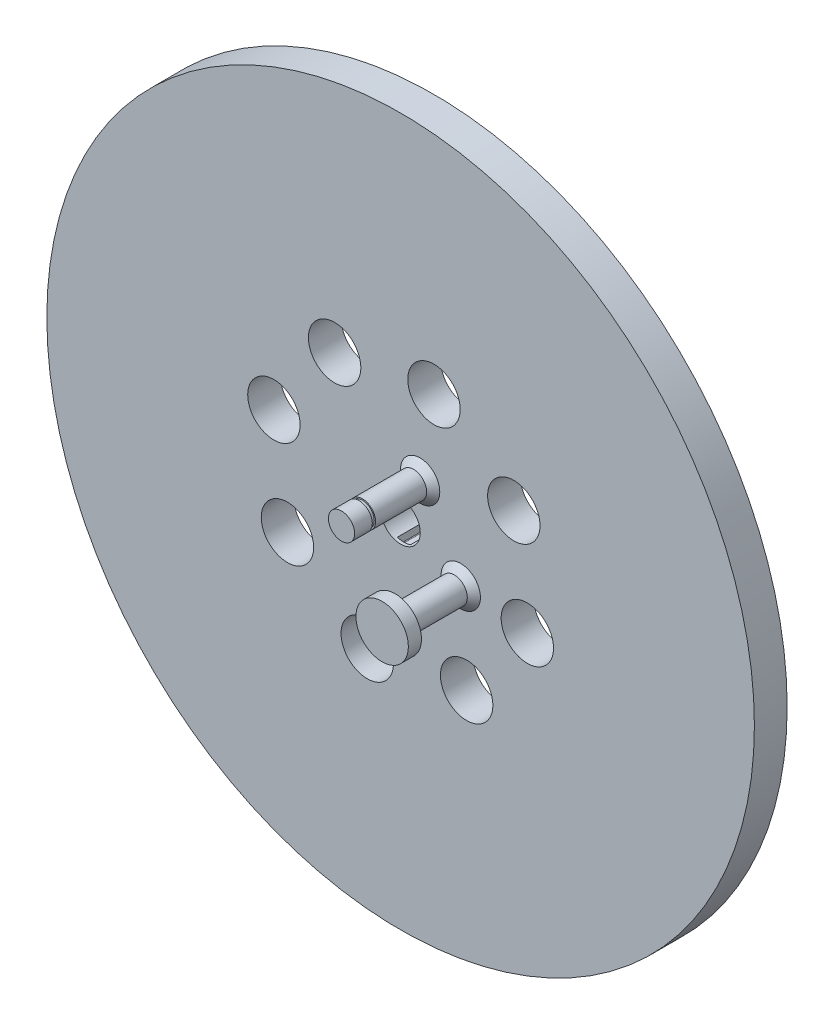
ISO-10303-21;
HEADER;
FILE_DESCRIPTION(('STEP AP214'),'2;1');
FILE_NAME('part.step','',(''),(''),'','','');
FILE_SCHEMA(('AUTOMOTIVE_DESIGN { 1 0 10303 214 1 1 1 1 }'));
ENDSEC;
DATA;
#1=APPLICATION_CONTEXT('core data for automotive mechanical design processes');
#2=APPLICATION_PROTOCOL_DEFINITION('international standard','automotive_design',2000,#1);
#3=PRODUCT_CONTEXT('',#1,'mechanical');
#4=PRODUCT('Part','Part','',(#3));
#5=PRODUCT_RELATED_PRODUCT_CATEGORY('part','',(#4));
#6=PRODUCT_DEFINITION_FORMATION('','',#4);
#7=PRODUCT_DEFINITION_CONTEXT('part definition',#1,'design');
#8=PRODUCT_DEFINITION('design','',#6,#7);
#9=PRODUCT_DEFINITION_SHAPE('','',#8);
#10=(LENGTH_UNIT() NAMED_UNIT(*) SI_UNIT(.MILLI.,.METRE.));
#11=(NAMED_UNIT(*) PLANE_ANGLE_UNIT() SI_UNIT($,.RADIAN.));
#12=(NAMED_UNIT(*) SI_UNIT($,.STERADIAN.) SOLID_ANGLE_UNIT());
#13=UNCERTAINTY_MEASURE_WITH_UNIT(LENGTH_MEASURE(1.E-05),#10,'distance_accuracy_value','');
#14=(GEOMETRIC_REPRESENTATION_CONTEXT(3) GLOBAL_UNCERTAINTY_ASSIGNED_CONTEXT((#13)) GLOBAL_UNIT_ASSIGNED_CONTEXT((#10,
#11,#12)) REPRESENTATION_CONTEXT('',''));
#15=CARTESIAN_POINT('',(0.,0.,0.));
#16=DIRECTION('',(0.,0.,1.));
#17=DIRECTION('',(1.,0.,0.));
#18=AXIS2_PLACEMENT_3D('',#15,#16,#17);
#19=CARTESIAN_POINT('',(0.,0.,5.));
#20=DIRECTION('',(0.,0.,-1.));
#21=DIRECTION('',(-1.,0.,0.));
#22=AXIS2_PLACEMENT_3D('',#19,#20,#21);
#23=CYLINDRICAL_SURFACE('',#22,3.);
#24=CARTESIAN_POINT('',(0.,0.,5.));
#25=DIRECTION('',(0.,0.,1.));
#26=DIRECTION('',(1.,0.,0.));
#27=AXIS2_PLACEMENT_3D('',#24,#25,#26);
#28=CIRCLE('',#27,3.);
#29=CARTESIAN_POINT('',(3.,0.,5.));
#30=VERTEX_POINT('',#29);
#31=EDGE_CURVE('E272',#30,#30,#28,.T.);
#32=ORIENTED_EDGE('',*,*,#31,.T.);
#33=EDGE_LOOP('',(#32));
#34=FACE_BOUND('',#33,.T.);
#35=CARTESIAN_POINT('',(0.,0.,0.));
#36=DIRECTION('',(0.,0.,1.));
#37=DIRECTION('',(1.,0.,0.));
#38=AXIS2_PLACEMENT_3D('',#35,#36,#37);
#39=CIRCLE('',#38,3.);
#40=CARTESIAN_POINT('',(3.,0.,0.));
#41=VERTEX_POINT('',#40);
#42=EDGE_CURVE('E268',#41,#41,#39,.T.);
#43=ORIENTED_EDGE('',*,*,#42,.F.);
#44=EDGE_LOOP('',(#43));
#45=FACE_BOUND('',#44,.T.);
#46=DIRECTION('',(0.,0.,-1.));
#47=VECTOR('',#46,1.);
#48=CARTESIAN_POINT('',(-0.999999999999999,-2.82842712474619,5.));
#49=LINE('',#48,#47);
#50=CARTESIAN_POINT('',(-0.999999999999999,-2.82842712474619,0.5));
#51=VERTEX_POINT('',#50);
#52=CARTESIAN_POINT('',(-0.999999999999999,-2.82842712474619,4.5));
#53=VERTEX_POINT('',#52);
#54=EDGE_CURVE('E129',#51,#53,#49,.F.);
#55=ORIENTED_EDGE('',*,*,#54,.F.);
#56=CARTESIAN_POINT('',(0.,0.,0.5));
#57=DIRECTION('',(0.,0.,1.));
#58=DIRECTION('',(1.,0.,0.));
#59=AXIS2_PLACEMENT_3D('',#56,#57,#58);
#60=CIRCLE('',#59,3.);
#61=CARTESIAN_POINT('',(1.,-2.82842712474619,0.5));
#62=VERTEX_POINT('',#61);
#63=EDGE_CURVE('E132',#51,#62,#60,.T.);
#64=ORIENTED_EDGE('',*,*,#63,.T.);
#65=DIRECTION('',(0.,0.,-1.));
#66=VECTOR('',#65,1.);
#67=CARTESIAN_POINT('',(1.,-2.82842712474619,5.));
#68=LINE('',#67,#66);
#69=CARTESIAN_POINT('',(1.,-2.82842712474619,4.5));
#70=VERTEX_POINT('',#69);
#71=EDGE_CURVE('E114',#70,#62,#68,.T.);
#72=ORIENTED_EDGE('',*,*,#71,.F.);
#73=CARTESIAN_POINT('',(0.,0.,4.5));
#74=DIRECTION('',(0.,0.,1.));
#75=DIRECTION('',(1.,0.,0.));
#76=AXIS2_PLACEMENT_3D('',#73,#74,#75);
#77=CIRCLE('',#76,3.);
#78=EDGE_CURVE('E122',#53,#70,#77,.T.);
#79=ORIENTED_EDGE('',*,*,#78,.F.);
#80=EDGE_LOOP('',(#55,#64,#72,#79));
#81=FACE_BOUND('',#80,.T.);
#82=ADVANCED_FACE('F53',(#34,#45,#81),#23,.F.);
#83=CARTESIAN_POINT('',(9.17867077053944,-3.96887929849786,17.));
#84=DIRECTION('',(0.,0.,-1.));
#85=DIRECTION('',(-1.,0.,0.));
#86=AXIS2_PLACEMENT_3D('',#83,#84,#85);
#87=CYLINDRICAL_SURFACE('',#86,2.);
#88=CARTESIAN_POINT('',(9.17867077053944,-3.96887929849786,6.00000000000001));
#89=DIRECTION('',(0.,0.,1.));
#90=DIRECTION('',(1.,0.,0.));
#91=AXIS2_PLACEMENT_3D('',#88,#89,#90);
#92=CIRCLE('',#91,2.);
#93=CARTESIAN_POINT('',(11.1786707705394,-3.96887929849786,6.00000000000001));
#94=VERTEX_POINT('',#93);
#95=EDGE_CURVE('E291',#94,#94,#92,.T.);
#96=ORIENTED_EDGE('',*,*,#95,.T.);
#97=EDGE_LOOP('',(#96));
#98=FACE_BOUND('',#97,.T.);
#99=CARTESIAN_POINT('',(9.17867077053944,-3.96887929849786,15.));
#100=DIRECTION('',(0.,0.,1.));
#101=DIRECTION('',(1.,0.,0.));
#102=AXIS2_PLACEMENT_3D('',#99,#100,#101);
#103=CIRCLE('',#102,2.);
#104=CARTESIAN_POINT('',(11.1786707705394,-3.96887929849786,15.));
#105=VERTEX_POINT('',#104);
#106=EDGE_CURVE('E284',#105,#105,#103,.T.);
#107=ORIENTED_EDGE('',*,*,#106,.F.);
#108=EDGE_LOOP('',(#107));
#109=FACE_BOUND('',#108,.T.);
#110=ADVANCED_FACE('F327',(#98,#109),#87,.T.);
#111=CARTESIAN_POINT('',(2.97665947387337,6.88400307790459,17.));
#112=DIRECTION('',(0.,0.,-1.));
#113=DIRECTION('',(-1.,0.,0.));
#114=AXIS2_PLACEMENT_3D('',#111,#112,#113);
#115=CYLINDRICAL_SURFACE('',#114,2.);
#116=CARTESIAN_POINT('',(2.97665947387337,6.88400307790459,6.00000000000001));
#117=DIRECTION('',(0.,0.,1.));
#118=DIRECTION('',(1.,0.,0.));
#119=AXIS2_PLACEMENT_3D('',#116,#117,#118);
#120=CIRCLE('',#119,2.);
#121=CARTESIAN_POINT('',(4.97665947387337,6.88400307790459,6.00000000000001));
#122=VERTEX_POINT('',#121);
#123=EDGE_CURVE('E130',#122,#122,#120,.T.);
#124=ORIENTED_EDGE('',*,*,#123,.T.);
#125=EDGE_LOOP('',(#124));
#126=FACE_BOUND('',#125,.T.);
#127=CARTESIAN_POINT('',(2.97665947387337,6.88400307790459,13.8));
#128=DIRECTION('',(0.,0.,1.));
#129=DIRECTION('',(1.,0.,0.));
#130=AXIS2_PLACEMENT_3D('',#127,#128,#129);
#131=CIRCLE('',#130,2.);
#132=CARTESIAN_POINT('',(4.97665947387337,6.88400307790459,13.8));
#133=VERTEX_POINT('',#132);
#134=EDGE_CURVE('E192',#133,#133,#131,.T.);
#135=ORIENTED_EDGE('',*,*,#134,.F.);
#136=EDGE_LOOP('',(#135));
#137=FACE_BOUND('',#136,.T.);
#138=ADVANCED_FACE('F307',(#126,#137),#115,.T.);
#139=CARTESIAN_POINT('',(0.,0.,5.));
#140=DIRECTION('',(0.,0.,1.));
#141=DIRECTION('',(1.,0.,0.));
#142=AXIS2_PLACEMENT_3D('',#139,#140,#141);
#143=PLANE('',#142);
#144=CARTESIAN_POINT('',(9.17867077053944,-3.96887929849786,5.));
#145=DIRECTION('',(0.,0.,1.));
#146=DIRECTION('',(1.,0.,0.));
#147=AXIS2_PLACEMENT_3D('',#144,#145,#146);
#148=CIRCLE('',#147,3.);
#149=CARTESIAN_POINT('',(12.1786707705394,-3.96887929849786,5.));
#150=VERTEX_POINT('',#149);
#151=EDGE_CURVE('E299',#150,#150,#148,.F.);
#152=ORIENTED_EDGE('',*,*,#151,.T.);
#153=EDGE_LOOP('',(#152));
#154=FACE_BOUND('',#153,.T.);
#155=CARTESIAN_POINT('',(2.97665947387337,6.88400307790459,5.));
#156=DIRECTION('',(0.,0.,1.));
#157=DIRECTION('',(1.,0.,0.));
#158=AXIS2_PLACEMENT_3D('',#155,#156,#157);
#159=CIRCLE('',#158,3.);
#160=CARTESIAN_POINT('',(5.97665947387337,6.88400307790459,5.));
#161=VERTEX_POINT('',#160);
#162=EDGE_CURVE('E295',#161,#161,#159,.F.);
#163=ORIENTED_EDGE('',*,*,#162,.T.);
#164=EDGE_LOOP('',(#163));
#165=FACE_BOUND('',#164,.T.);
#166=CARTESIAN_POINT('',(17.2762876026621,10.0762039811679,5.));
#167=DIRECTION('',(0.,0.,-1.));
#168=DIRECTION('',(-1.,0.,0.));
#169=AXIS2_PLACEMENT_3D('',#166,#167,#168);
#170=CIRCLE('',#169,4.);
#171=CARTESIAN_POINT('',(13.2762876026621,10.0762039811679,5.));
#172=VERTEX_POINT('',#171);
#173=EDGE_CURVE('E207',#172,#172,#170,.T.);
#174=ORIENTED_EDGE('',*,*,#173,.T.);
#175=EDGE_LOOP('',(#174));
#176=FACE_BOUND('',#175,.T.);
#177=CARTESIAN_POINT('',(19.3411322812741,-5.0912279538688,5.));
#178=DIRECTION('',(0.,0.,-1.));
#179=DIRECTION('',(-1.,0.,0.));
#180=AXIS2_PLACEMENT_3D('',#177,#178,#179);
#181=CIRCLE('',#180,4.);
#182=CARTESIAN_POINT('',(15.3411322812741,-5.0912279538688,5.));
#183=VERTEX_POINT('',#182);
#184=EDGE_CURVE('E253',#183,#183,#181,.T.);
#185=ORIENTED_EDGE('',*,*,#184,.T.);
#186=EDGE_LOOP('',(#185));
#187=FACE_BOUND('',#186,.T.);
#188=CARTESIAN_POINT('',(10.0762039811678,-17.2762876026621,5.));
#189=DIRECTION('',(0.,0.,-1.));
#190=DIRECTION('',(-1.,0.,0.));
#191=AXIS2_PLACEMENT_3D('',#188,#189,#190);
#192=CIRCLE('',#191,4.);
#193=CARTESIAN_POINT('',(6.07620398116782,-17.2762876026621,5.));
#194=VERTEX_POINT('',#193);
#195=EDGE_CURVE('E245',#194,#194,#192,.T.);
#196=ORIENTED_EDGE('',*,*,#195,.T.);
#197=EDGE_LOOP('',(#196));
#198=FACE_BOUND('',#197,.T.);
#199=CARTESIAN_POINT('',(-5.09122795386886,-19.3411322812741,5.));
#200=DIRECTION('',(0.,0.,-1.));
#201=DIRECTION('',(-1.,0.,0.));
#202=AXIS2_PLACEMENT_3D('',#199,#200,#201);
#203=CIRCLE('',#202,4.);
#204=CARTESIAN_POINT('',(-9.09122795386886,-19.3411322812741,5.));
#205=VERTEX_POINT('',#204);
#206=EDGE_CURVE('E237',#205,#205,#203,.T.);
#207=ORIENTED_EDGE('',*,*,#206,.T.);
#208=EDGE_LOOP('',(#207));
#209=FACE_BOUND('',#208,.T.);
#210=CARTESIAN_POINT('',(-17.2762876026622,-10.0762039811678,5.));
#211=DIRECTION('',(0.,0.,-1.));
#212=DIRECTION('',(-1.,0.,0.));
#213=AXIS2_PLACEMENT_3D('',#210,#211,#212);
#214=CIRCLE('',#213,4.);
#215=CARTESIAN_POINT('',(-21.2762876026622,-10.0762039811678,5.));
#216=VERTEX_POINT('',#215);
#217=EDGE_CURVE('E229',#216,#216,#214,.T.);
#218=ORIENTED_EDGE('',*,*,#217,.T.);
#219=EDGE_LOOP('',(#218));
#220=FACE_BOUND('',#219,.T.);
#221=CARTESIAN_POINT('',(-19.3411322812741,5.09122795386893,5.));
#222=DIRECTION('',(0.,0.,-1.));
#223=DIRECTION('',(-1.,0.,0.));
#224=AXIS2_PLACEMENT_3D('',#221,#222,#223);
#225=CIRCLE('',#224,4.);
#226=CARTESIAN_POINT('',(-23.3411322812741,5.09122795386893,5.));
#227=VERTEX_POINT('',#226);
#228=EDGE_CURVE('E221',#227,#227,#225,.T.);
#229=ORIENTED_EDGE('',*,*,#228,.T.);
#230=EDGE_LOOP('',(#229));
#231=FACE_BOUND('',#230,.T.);
#232=CARTESIAN_POINT('',(-10.0762039811677,17.2762876026622,5.));
#233=DIRECTION('',(0.,0.,-1.));
#234=DIRECTION('',(-1.,0.,0.));
#235=AXIS2_PLACEMENT_3D('',#232,#233,#234);
#236=CIRCLE('',#235,4.);
#237=CARTESIAN_POINT('',(-14.0762039811677,17.2762876026622,5.));
#238=VERTEX_POINT('',#237);
#239=EDGE_CURVE('E213',#238,#238,#236,.T.);
#240=ORIENTED_EDGE('',*,*,#239,.T.);
#241=EDGE_LOOP('',(#240));
#242=FACE_BOUND('',#241,.T.);
#243=CARTESIAN_POINT('',(5.091227953869,19.3411322812741,5.));
#244=DIRECTION('',(0.,0.,-1.));
#245=DIRECTION('',(-1.,0.,0.));
#246=AXIS2_PLACEMENT_3D('',#243,#244,#245);
#247=CIRCLE('',#246,4.);
#248=CARTESIAN_POINT('',(1.091227953869,19.3411322812741,5.));
#249=VERTEX_POINT('',#248);
#250=EDGE_CURVE('E264',#249,#249,#247,.T.);
#251=ORIENTED_EDGE('',*,*,#250,.T.);
#252=EDGE_LOOP('',(#251));
#253=FACE_BOUND('',#252,.T.);
#254=CARTESIAN_POINT('',(0.,0.,5.));
#255=DIRECTION('',(0.,0.,1.));
#256=DIRECTION('',(1.,0.,0.));
#257=AXIS2_PLACEMENT_3D('',#254,#255,#256);
#258=CIRCLE('',#257,54.);
#259=CARTESIAN_POINT('',(54.,0.,5.));
#260=VERTEX_POINT('',#259);
#261=EDGE_CURVE('E280',#260,#260,#258,.T.);
#262=ORIENTED_EDGE('',*,*,#261,.T.);
#263=EDGE_LOOP('',(#262));
#264=FACE_BOUND('',#263,.T.);
#265=ORIENTED_EDGE('',*,*,#31,.F.);
#266=EDGE_LOOP('',(#265));
#267=FACE_BOUND('',#266,.T.);
#268=ADVANCED_FACE('F341',(#154,#165,#176,#187,#198,#209,#220,#231,#242,#253,#264,#267),#143,.T.);
#269=CARTESIAN_POINT('',(0.,0.,0.));
#270=DIRECTION('',(0.,0.,1.));
#271=DIRECTION('',(1.,0.,0.));
#272=AXIS2_PLACEMENT_3D('',#269,#270,#271);
#273=PLANE('',#272);
#274=CARTESIAN_POINT('',(17.2762876026621,10.0762039811679,0.));
#275=DIRECTION('',(0.,0.,-1.));
#276=DIRECTION('',(-1.,0.,0.));
#277=AXIS2_PLACEMENT_3D('',#274,#275,#276);
#278=CIRCLE('',#277,4.);
#279=CARTESIAN_POINT('',(13.2762876026621,10.0762039811679,0.));
#280=VERTEX_POINT('',#279);
#281=EDGE_CURVE('E257',#280,#280,#278,.T.);
#282=ORIENTED_EDGE('',*,*,#281,.F.);
#283=EDGE_LOOP('',(#282));
#284=FACE_BOUND('',#283,.T.);
#285=CARTESIAN_POINT('',(19.3411322812741,-5.0912279538688,0.));
#286=DIRECTION('',(0.,0.,-1.));
#287=DIRECTION('',(-1.,0.,0.));
#288=AXIS2_PLACEMENT_3D('',#285,#286,#287);
#289=CIRCLE('',#288,4.);
#290=CARTESIAN_POINT('',(15.3411322812741,-5.0912279538688,0.));
#291=VERTEX_POINT('',#290);
#292=EDGE_CURVE('E249',#291,#291,#289,.T.);
#293=ORIENTED_EDGE('',*,*,#292,.F.);
#294=EDGE_LOOP('',(#293));
#295=FACE_BOUND('',#294,.T.);
#296=CARTESIAN_POINT('',(10.0762039811678,-17.2762876026621,0.));
#297=DIRECTION('',(0.,0.,-1.));
#298=DIRECTION('',(-1.,0.,0.));
#299=AXIS2_PLACEMENT_3D('',#296,#297,#298);
#300=CIRCLE('',#299,4.);
#301=CARTESIAN_POINT('',(6.07620398116782,-17.2762876026621,0.));
#302=VERTEX_POINT('',#301);
#303=EDGE_CURVE('E241',#302,#302,#300,.T.);
#304=ORIENTED_EDGE('',*,*,#303,.F.);
#305=EDGE_LOOP('',(#304));
#306=FACE_BOUND('',#305,.T.);
#307=CARTESIAN_POINT('',(-5.09122795386886,-19.3411322812741,0.));
#308=DIRECTION('',(0.,0.,-1.));
#309=DIRECTION('',(-1.,0.,0.));
#310=AXIS2_PLACEMENT_3D('',#307,#308,#309);
#311=CIRCLE('',#310,4.);
#312=CARTESIAN_POINT('',(-9.09122795386886,-19.3411322812741,0.));
#313=VERTEX_POINT('',#312);
#314=EDGE_CURVE('E233',#313,#313,#311,.T.);
#315=ORIENTED_EDGE('',*,*,#314,.F.);
#316=EDGE_LOOP('',(#315));
#317=FACE_BOUND('',#316,.T.);
#318=CARTESIAN_POINT('',(-17.2762876026622,-10.0762039811678,0.));
#319=DIRECTION('',(0.,0.,-1.));
#320=DIRECTION('',(-1.,0.,0.));
#321=AXIS2_PLACEMENT_3D('',#318,#319,#320);
#322=CIRCLE('',#321,4.);
#323=CARTESIAN_POINT('',(-21.2762876026622,-10.0762039811678,0.));
#324=VERTEX_POINT('',#323);
#325=EDGE_CURVE('E225',#324,#324,#322,.T.);
#326=ORIENTED_EDGE('',*,*,#325,.F.);
#327=EDGE_LOOP('',(#326));
#328=FACE_BOUND('',#327,.T.);
#329=CARTESIAN_POINT('',(-19.3411322812741,5.09122795386893,0.));
#330=DIRECTION('',(0.,0.,-1.));
#331=DIRECTION('',(-1.,0.,0.));
#332=AXIS2_PLACEMENT_3D('',#329,#330,#331);
#333=CIRCLE('',#332,4.);
#334=CARTESIAN_POINT('',(-23.3411322812741,5.09122795386893,0.));
#335=VERTEX_POINT('',#334);
#336=EDGE_CURVE('E217',#335,#335,#333,.T.);
#337=ORIENTED_EDGE('',*,*,#336,.F.);
#338=EDGE_LOOP('',(#337));
#339=FACE_BOUND('',#338,.T.);
#340=CARTESIAN_POINT('',(-10.0762039811677,17.2762876026622,0.));
#341=DIRECTION('',(0.,0.,-1.));
#342=DIRECTION('',(-1.,0.,0.));
#343=AXIS2_PLACEMENT_3D('',#340,#341,#342);
#344=CIRCLE('',#343,4.);
#345=CARTESIAN_POINT('',(-14.0762039811677,17.2762876026622,0.));
#346=VERTEX_POINT('',#345);
#347=EDGE_CURVE('E208',#346,#346,#344,.T.);
#348=ORIENTED_EDGE('',*,*,#347,.F.);
#349=EDGE_LOOP('',(#348));
#350=FACE_BOUND('',#349,.T.);
#351=CARTESIAN_POINT('',(5.091227953869,19.3411322812741,0.));
#352=DIRECTION('',(0.,0.,-1.));
#353=DIRECTION('',(-1.,0.,0.));
#354=AXIS2_PLACEMENT_3D('',#351,#352,#353);
#355=CIRCLE('',#354,4.);
#356=CARTESIAN_POINT('',(1.091227953869,19.3411322812741,0.));
#357=VERTEX_POINT('',#356);
#358=EDGE_CURVE('E212',#357,#357,#355,.T.);
#359=ORIENTED_EDGE('',*,*,#358,.F.);
#360=EDGE_LOOP('',(#359));
#361=FACE_BOUND('',#360,.T.);
#362=CARTESIAN_POINT('',(0.,0.,0.));
#363=DIRECTION('',(0.,0.,1.));
#364=DIRECTION('',(1.,0.,0.));
#365=AXIS2_PLACEMENT_3D('',#362,#363,#364);
#366=CIRCLE('',#365,54.);
#367=CARTESIAN_POINT('',(54.,0.,0.));
#368=VERTEX_POINT('',#367);
#369=EDGE_CURVE('E276',#368,#368,#366,.T.);
#370=ORIENTED_EDGE('',*,*,#369,.F.);
#371=EDGE_LOOP('',(#370));
#372=FACE_BOUND('',#371,.T.);
#373=ORIENTED_EDGE('',*,*,#42,.T.);
#374=EDGE_LOOP('',(#373));
#375=FACE_BOUND('',#374,.T.);
#376=ADVANCED_FACE('F343',(#284,#295,#306,#317,#328,#339,#350,#361,#372,#375),#273,.F.);
#377=CARTESIAN_POINT('',(0.,0.,5.));
#378=DIRECTION('',(0.,0.,-1.));
#379=DIRECTION('',(-1.,0.,0.));
#380=AXIS2_PLACEMENT_3D('',#377,#378,#379);
#381=CYLINDRICAL_SURFACE('',#380,54.);
#382=ORIENTED_EDGE('',*,*,#261,.F.);
#383=EDGE_LOOP('',(#382));
#384=FACE_BOUND('',#383,.T.);
#385=ORIENTED_EDGE('',*,*,#369,.T.);
#386=EDGE_LOOP('',(#385));
#387=FACE_BOUND('',#386,.T.);
#388=ADVANCED_FACE('F347',(#384,#387),#381,.T.);
#389=CARTESIAN_POINT('',(5.091227953869,19.3411322812741,5.));
#390=DIRECTION('',(0.,0.,-1.));
#391=DIRECTION('',(-1.,0.,0.));
#392=AXIS2_PLACEMENT_3D('',#389,#390,#391);
#393=CYLINDRICAL_SURFACE('',#392,4.);
#394=ORIENTED_EDGE('',*,*,#250,.F.);
#395=EDGE_LOOP('',(#394));
#396=FACE_BOUND('',#395,.T.);
#397=ORIENTED_EDGE('',*,*,#358,.T.);
#398=EDGE_LOOP('',(#397));
#399=FACE_BOUND('',#398,.T.);
#400=ADVANCED_FACE('F339',(#396,#399),#393,.F.);
#401=CARTESIAN_POINT('',(-10.0762039811677,17.2762876026622,5.));
#402=DIRECTION('',(0.,0.,-1.));
#403=DIRECTION('',(-1.,0.,0.));
#404=AXIS2_PLACEMENT_3D('',#401,#402,#403);
#405=CYLINDRICAL_SURFACE('',#404,4.);
#406=ORIENTED_EDGE('',*,*,#239,.F.);
#407=EDGE_LOOP('',(#406));
#408=FACE_BOUND('',#407,.T.);
#409=ORIENTED_EDGE('',*,*,#347,.T.);
#410=EDGE_LOOP('',(#409));
#411=FACE_BOUND('',#410,.T.);
#412=ADVANCED_FACE('F359',(#408,#411),#405,.F.);
#413=CARTESIAN_POINT('',(-19.3411322812741,5.09122795386893,5.));
#414=DIRECTION('',(0.,0.,-1.));
#415=DIRECTION('',(-1.,0.,0.));
#416=AXIS2_PLACEMENT_3D('',#413,#414,#415);
#417=CYLINDRICAL_SURFACE('',#416,4.);
#418=ORIENTED_EDGE('',*,*,#228,.F.);
#419=EDGE_LOOP('',(#418));
#420=FACE_BOUND('',#419,.T.);
#421=ORIENTED_EDGE('',*,*,#336,.T.);
#422=EDGE_LOOP('',(#421));
#423=FACE_BOUND('',#422,.T.);
#424=ADVANCED_FACE('F374',(#420,#423),#417,.F.);
#425=CARTESIAN_POINT('',(-17.2762876026622,-10.0762039811678,5.));
#426=DIRECTION('',(0.,0.,-1.));
#427=DIRECTION('',(-1.,0.,0.));
#428=AXIS2_PLACEMENT_3D('',#425,#426,#427);
#429=CYLINDRICAL_SURFACE('',#428,4.);
#430=ORIENTED_EDGE('',*,*,#217,.F.);
#431=EDGE_LOOP('',(#430));
#432=FACE_BOUND('',#431,.T.);
#433=ORIENTED_EDGE('',*,*,#325,.T.);
#434=EDGE_LOOP('',(#433));
#435=FACE_BOUND('',#434,.T.);
#436=ADVANCED_FACE('F385',(#432,#435),#429,.F.);
#437=CARTESIAN_POINT('',(-5.09122795386886,-19.3411322812741,5.));
#438=DIRECTION('',(0.,0.,-1.));
#439=DIRECTION('',(-1.,0.,0.));
#440=AXIS2_PLACEMENT_3D('',#437,#438,#439);
#441=CYLINDRICAL_SURFACE('',#440,4.);
#442=ORIENTED_EDGE('',*,*,#206,.F.);
#443=EDGE_LOOP('',(#442));
#444=FACE_BOUND('',#443,.T.);
#445=ORIENTED_EDGE('',*,*,#314,.T.);
#446=EDGE_LOOP('',(#445));
#447=FACE_BOUND('',#446,.T.);
#448=ADVANCED_FACE('F396',(#444,#447),#441,.F.);
#449=CARTESIAN_POINT('',(10.0762039811678,-17.2762876026621,5.));
#450=DIRECTION('',(0.,0.,-1.));
#451=DIRECTION('',(-1.,0.,0.));
#452=AXIS2_PLACEMENT_3D('',#449,#450,#451);
#453=CYLINDRICAL_SURFACE('',#452,4.);
#454=ORIENTED_EDGE('',*,*,#195,.F.);
#455=EDGE_LOOP('',(#454));
#456=FACE_BOUND('',#455,.T.);
#457=ORIENTED_EDGE('',*,*,#303,.T.);
#458=EDGE_LOOP('',(#457));
#459=FACE_BOUND('',#458,.T.);
#460=ADVANCED_FACE('F400',(#456,#459),#453,.F.);
#461=CARTESIAN_POINT('',(19.3411322812741,-5.0912279538688,5.));
#462=DIRECTION('',(0.,0.,-1.));
#463=DIRECTION('',(-1.,0.,0.));
#464=AXIS2_PLACEMENT_3D('',#461,#462,#463);
#465=CYLINDRICAL_SURFACE('',#464,4.);
#466=ORIENTED_EDGE('',*,*,#184,.F.);
#467=EDGE_LOOP('',(#466));
#468=FACE_BOUND('',#467,.T.);
#469=ORIENTED_EDGE('',*,*,#292,.T.);
#470=EDGE_LOOP('',(#469));
#471=FACE_BOUND('',#470,.T.);
#472=ADVANCED_FACE('F404',(#468,#471),#465,.F.);
#473=CARTESIAN_POINT('',(17.2762876026621,10.0762039811679,5.));
#474=DIRECTION('',(0.,0.,-1.));
#475=DIRECTION('',(-1.,0.,0.));
#476=AXIS2_PLACEMENT_3D('',#473,#474,#475);
#477=CYLINDRICAL_SURFACE('',#476,4.);
#478=ORIENTED_EDGE('',*,*,#173,.F.);
#479=EDGE_LOOP('',(#478));
#480=FACE_BOUND('',#479,.T.);
#481=ORIENTED_EDGE('',*,*,#281,.T.);
#482=EDGE_LOOP('',(#481));
#483=FACE_BOUND('',#482,.T.);
#484=ADVANCED_FACE('F407',(#480,#483),#477,.F.);
#485=CARTESIAN_POINT('',(2.97665947387337,6.88400307790459,14.3));
#486=DIRECTION('',(0.,0.,1.));
#487=DIRECTION('',(1.,0.,0.));
#488=AXIS2_PLACEMENT_3D('',#485,#486,#487);
#489=PLANE('',#488);
#490=CARTESIAN_POINT('',(2.97665947387337,6.88400307790459,14.3));
#491=DIRECTION('',(0.,0.,1.));
#492=DIRECTION('',(1.,0.,0.));
#493=AXIS2_PLACEMENT_3D('',#490,#491,#492);
#494=CIRCLE('',#493,2.);
#495=CARTESIAN_POINT('',(4.97665947387337,6.88400307790459,14.3));
#496=VERTEX_POINT('',#495);
#497=EDGE_CURVE('E196',#496,#496,#494,.T.);
#498=ORIENTED_EDGE('',*,*,#497,.F.);
#499=EDGE_LOOP('',(#498));
#500=FACE_BOUND('',#499,.T.);
#501=CARTESIAN_POINT('',(2.97665947387337,6.88400307790459,14.3));
#502=DIRECTION('',(0.,0.,1.));
#503=DIRECTION('',(1.,0.,0.));
#504=AXIS2_PLACEMENT_3D('',#501,#502,#503);
#505=CIRCLE('',#504,1.8);
#506=CARTESIAN_POINT('',(4.77665947387337,6.88400307790459,14.3));
#507=VERTEX_POINT('',#506);
#508=EDGE_CURVE('E188',#507,#507,#505,.T.);
#509=ORIENTED_EDGE('',*,*,#508,.T.);
#510=EDGE_LOOP('',(#509));
#511=FACE_BOUND('',#510,.T.);
#512=ADVANCED_FACE('F410',(#500,#511),#489,.F.);
#513=CARTESIAN_POINT('',(2.97665947387337,6.88400307790459,13.8));
#514=DIRECTION('',(0.,0.,1.));
#515=DIRECTION('',(1.,0.,0.));
#516=AXIS2_PLACEMENT_3D('',#513,#514,#515);
#517=PLANE('',#516);
#518=ORIENTED_EDGE('',*,*,#134,.T.);
#519=EDGE_LOOP('',(#518));
#520=FACE_BOUND('',#519,.T.);
#521=CARTESIAN_POINT('',(2.97665947387337,6.88400307790459,13.8));
#522=DIRECTION('',(0.,0.,1.));
#523=DIRECTION('',(1.,0.,0.));
#524=AXIS2_PLACEMENT_3D('',#521,#522,#523);
#525=CIRCLE('',#524,1.8);
#526=CARTESIAN_POINT('',(4.77665947387337,6.88400307790459,13.8));
#527=VERTEX_POINT('',#526);
#528=EDGE_CURVE('E184',#527,#527,#525,.T.);
#529=ORIENTED_EDGE('',*,*,#528,.F.);
#530=EDGE_LOOP('',(#529));
#531=FACE_BOUND('',#530,.T.);
#532=ADVANCED_FACE('F416',(#520,#531),#517,.T.);
#533=CARTESIAN_POINT('',(2.97665947387337,6.88400307790459,14.3));
#534=DIRECTION('',(0.,0.,-1.));
#535=DIRECTION('',(-1.,0.,0.));
#536=AXIS2_PLACEMENT_3D('',#533,#534,#535);
#537=CYLINDRICAL_SURFACE('',#536,1.8);
#538=ORIENTED_EDGE('',*,*,#508,.F.);
#539=EDGE_LOOP('',(#538));
#540=FACE_BOUND('',#539,.T.);
#541=ORIENTED_EDGE('',*,*,#528,.T.);
#542=EDGE_LOOP('',(#541));
#543=FACE_BOUND('',#542,.T.);
#544=ADVANCED_FACE('F454',(#540,#543),#537,.T.);
#545=CARTESIAN_POINT('',(2.97665947387337,6.88400307790459,17.));
#546=DIRECTION('',(0.,0.,1.));
#547=DIRECTION('',(1.,0.,0.));
#548=AXIS2_PLACEMENT_3D('',#545,#546,#547);
#549=PLANE('',#548);
#550=CARTESIAN_POINT('',(2.97665947387337,6.88400307790459,17.));
#551=DIRECTION('',(0.,0.,1.));
#552=DIRECTION('',(1.,0.,0.));
#553=AXIS2_PLACEMENT_3D('',#550,#551,#552);
#554=CIRCLE('',#553,2.);
#555=CARTESIAN_POINT('',(4.97665947387337,6.88400307790459,17.));
#556=VERTEX_POINT('',#555);
#557=EDGE_CURVE('E200',#556,#556,#554,.T.);
#558=ORIENTED_EDGE('',*,*,#557,.T.);
#559=EDGE_LOOP('',(#558));
#560=FACE_BOUND('',#559,.T.);
#561=ADVANCED_FACE('F465',(#560),#549,.T.);
#562=ORIENTED_EDGE('',*,*,#497,.T.);
#563=EDGE_LOOP('',(#562));
#564=FACE_BOUND('',#563,.T.);
#565=ORIENTED_EDGE('',*,*,#557,.F.);
#566=EDGE_LOOP('',(#565));
#567=FACE_BOUND('',#566,.T.);
#568=ADVANCED_FACE('F391',(#564,#567),#115,.T.);
#569=CARTESIAN_POINT('',(9.17867077053944,-3.96887929849786,15.));
#570=DIRECTION('',(0.,0.,1.));
#571=DIRECTION('',(1.,0.,0.));
#572=AXIS2_PLACEMENT_3D('',#569,#570,#571);
#573=CYLINDRICAL_SURFACE('',#572,4.);
#574=CARTESIAN_POINT('',(9.17867077053944,-3.96887929849786,15.));
#575=DIRECTION('',(0.,0.,1.));
#576=DIRECTION('',(1.,0.,0.));
#577=AXIS2_PLACEMENT_3D('',#574,#575,#576);
#578=CIRCLE('',#577,4.);
#579=CARTESIAN_POINT('',(13.1786707705394,-3.96887929849786,15.));
#580=VERTEX_POINT('',#579);
#581=EDGE_CURVE('E180',#580,#580,#578,.T.);
#582=ORIENTED_EDGE('',*,*,#581,.T.);
#583=EDGE_LOOP('',(#582));
#584=FACE_BOUND('',#583,.T.);
#585=CARTESIAN_POINT('',(9.17867077053944,-3.96887929849786,17.));
#586=DIRECTION('',(0.,0.,1.));
#587=DIRECTION('',(1.,0.,0.));
#588=AXIS2_PLACEMENT_3D('',#585,#586,#587);
#589=CIRCLE('',#588,4.);
#590=CARTESIAN_POINT('',(13.1786707705394,-3.96887929849786,17.));
#591=VERTEX_POINT('',#590);
#592=EDGE_CURVE('E169',#591,#591,#589,.T.);
#593=ORIENTED_EDGE('',*,*,#592,.F.);
#594=EDGE_LOOP('',(#593));
#595=FACE_BOUND('',#594,.T.);
#596=ADVANCED_FACE('F470',(#584,#595),#573,.T.);
#597=CARTESIAN_POINT('',(9.17867077053944,-3.96887929849786,15.));
#598=DIRECTION('',(0.,0.,1.));
#599=DIRECTION('',(1.,0.,0.));
#600=AXIS2_PLACEMENT_3D('',#597,#598,#599);
#601=PLANE('',#600);
#602=ORIENTED_EDGE('',*,*,#106,.T.);
#603=EDGE_LOOP('',(#602));
#604=FACE_BOUND('',#603,.T.);
#605=ORIENTED_EDGE('',*,*,#581,.F.);
#606=EDGE_LOOP('',(#605));
#607=FACE_BOUND('',#606,.T.);
#608=ADVANCED_FACE('F463',(#604,#607),#601,.F.);
#609=CARTESIAN_POINT('',(9.17867077053944,-3.96887929849786,17.));
#610=DIRECTION('',(0.,0.,1.));
#611=DIRECTION('',(1.,0.,0.));
#612=AXIS2_PLACEMENT_3D('',#609,#610,#611);
#613=PLANE('',#612);
#614=ORIENTED_EDGE('',*,*,#592,.T.);
#615=EDGE_LOOP('',(#614));
#616=FACE_BOUND('',#615,.T.);
#617=ADVANCED_FACE('F321',(#616),#613,.T.);
#618=CARTESIAN_POINT('',(9.17867077053944,-3.96887929849786,6.00000000000001));
#619=DIRECTION('',(0.,0.,-1.));
#620=DIRECTION('',(-1.,0.,0.));
#621=AXIS2_PLACEMENT_3D('',#618,#619,#620);
#622=CONICAL_SURFACE('',#621,2.,0.785398163397446);
#623=ORIENTED_EDGE('',*,*,#151,.F.);
#624=EDGE_LOOP('',(#623));
#625=FACE_BOUND('',#624,.T.);
#626=ORIENTED_EDGE('',*,*,#95,.F.);
#627=EDGE_LOOP('',(#626));
#628=FACE_BOUND('',#627,.T.);
#629=ADVANCED_FACE('F312',(#625,#628),#622,.T.);
#630=CARTESIAN_POINT('',(2.97665947387337,6.88400307790459,6.00000000000001));
#631=DIRECTION('',(0.,0.,-1.));
#632=DIRECTION('',(-1.,0.,0.));
#633=AXIS2_PLACEMENT_3D('',#630,#631,#632);
#634=CONICAL_SURFACE('',#633,2.,0.785398163397446);
#635=ORIENTED_EDGE('',*,*,#162,.F.);
#636=EDGE_LOOP('',(#635));
#637=FACE_BOUND('',#636,.T.);
#638=ORIENTED_EDGE('',*,*,#123,.F.);
#639=EDGE_LOOP('',(#638));
#640=FACE_BOUND('',#639,.T.);
#641=ADVANCED_FACE('F310',(#637,#640),#634,.T.);
#642=CARTESIAN_POINT('',(1.,-2.,0.5));
#643=DIRECTION('',(1.,0.,0.));
#644=DIRECTION('',(0.,0.,-1.));
#645=AXIS2_PLACEMENT_3D('',#642,#643,#644);
#646=PLANE('',#645);
#647=DIRECTION('',(0.,1.,0.));
#648=VECTOR('',#647,1.);
#649=CARTESIAN_POINT('',(1.,-2.,0.5));
#650=LINE('',#649,#648);
#651=CARTESIAN_POINT('',(1.,-3.9,0.5));
#652=VERTEX_POINT('',#651);
#653=EDGE_CURVE('E177',#652,#62,#650,.T.);
#654=ORIENTED_EDGE('',*,*,#653,.F.);
#655=DIRECTION('',(0.,0.,1.));
#656=VECTOR('',#655,1.);
#657=CARTESIAN_POINT('',(1.,-3.9,4.5));
#658=LINE('',#657,#656);
#659=CARTESIAN_POINT('',(1.,-3.9,4.5));
#660=VERTEX_POINT('',#659);
#661=EDGE_CURVE('E11',#652,#660,#658,.T.);
#662=ORIENTED_EDGE('',*,*,#661,.T.);
#663=DIRECTION('',(0.,1.,0.));
#664=VECTOR('',#663,1.);
#665=CARTESIAN_POINT('',(1.,-2.,4.5));
#666=LINE('',#665,#664);
#667=EDGE_CURVE('E110',#660,#70,#666,.T.);
#668=ORIENTED_EDGE('',*,*,#667,.T.);
#669=ORIENTED_EDGE('',*,*,#71,.T.);
#670=EDGE_LOOP('',(#654,#662,#668,#669));
#671=FACE_BOUND('',#670,.T.);
#672=ADVANCED_FACE('F112',(#671),#646,.F.);
#673=CARTESIAN_POINT('',(-0.999999999999999,-4.,0.5));
#674=DIRECTION('',(0.,-1.,0.));
#675=DIRECTION('',(0.,0.,-1.));
#676=AXIS2_PLACEMENT_3D('',#673,#674,#675);
#677=PLANE('',#676);
#678=DIRECTION('',(1.,0.,0.));
#679=VECTOR('',#678,1.);
#680=CARTESIAN_POINT('',(-0.999999999999999,-4.,0.5));
#681=LINE('',#680,#679);
#682=CARTESIAN_POINT('',(-0.899999999999999,-4.,0.5));
#683=VERTEX_POINT('',#682);
#684=CARTESIAN_POINT('',(0.900000000000001,-4.,0.5));
#685=VERTEX_POINT('',#684);
#686=EDGE_CURVE('E160',#683,#685,#681,.T.);
#687=ORIENTED_EDGE('',*,*,#686,.F.);
#688=DIRECTION('',(0.,0.,1.));
#689=VECTOR('',#688,1.);
#690=CARTESIAN_POINT('',(-0.899999999999999,-4.,4.5));
#691=LINE('',#690,#689);
#692=CARTESIAN_POINT('',(-0.899999999999999,-4.,4.5));
#693=VERTEX_POINT('',#692);
#694=EDGE_CURVE('E143',#683,#693,#691,.T.);
#695=ORIENTED_EDGE('',*,*,#694,.T.);
#696=DIRECTION('',(1.,0.,0.));
#697=VECTOR('',#696,1.);
#698=CARTESIAN_POINT('',(-0.999999999999999,-4.,4.5));
#699=LINE('',#698,#697);
#700=CARTESIAN_POINT('',(0.900000000000001,-4.,4.5));
#701=VERTEX_POINT('',#700);
#702=EDGE_CURVE('E172',#693,#701,#699,.T.);
#703=ORIENTED_EDGE('',*,*,#702,.T.);
#704=DIRECTION('',(0.,0.,1.));
#705=VECTOR('',#704,1.);
#706=CARTESIAN_POINT('',(0.900000000000001,-4.,0.5));
#707=LINE('',#706,#705);
#708=EDGE_CURVE('E137',#701,#685,#707,.F.);
#709=ORIENTED_EDGE('',*,*,#708,.T.);
#710=EDGE_LOOP('',(#687,#695,#703,#709));
#711=FACE_BOUND('',#710,.T.);
#712=ADVANCED_FACE('F165',(#711),#677,.F.);
#713=CARTESIAN_POINT('',(-0.999999999999999,-2.,0.5));
#714=DIRECTION('',(-1.,0.,0.));
#715=DIRECTION('',(0.,0.,1.));
#716=AXIS2_PLACEMENT_3D('',#713,#714,#715);
#717=PLANE('',#716);
#718=DIRECTION('',(0.,-1.,0.));
#719=VECTOR('',#718,1.);
#720=CARTESIAN_POINT('',(-0.999999999999999,-2.,4.5));
#721=LINE('',#720,#719);
#722=CARTESIAN_POINT('',(-0.999999999999999,-3.9,4.5));
#723=VERTEX_POINT('',#722);
#724=EDGE_CURVE('E119',#53,#723,#721,.T.);
#725=ORIENTED_EDGE('',*,*,#724,.T.);
#726=DIRECTION('',(0.,0.,1.));
#727=VECTOR('',#726,1.);
#728=CARTESIAN_POINT('',(-0.999999999999999,-3.9,0.5));
#729=LINE('',#728,#727);
#730=CARTESIAN_POINT('',(-0.999999999999999,-3.9,0.5));
#731=VERTEX_POINT('',#730);
#732=EDGE_CURVE('E77',#723,#731,#729,.F.);
#733=ORIENTED_EDGE('',*,*,#732,.T.);
#734=DIRECTION('',(0.,-1.,0.));
#735=VECTOR('',#734,1.);
#736=CARTESIAN_POINT('',(-0.999999999999999,-2.,0.5));
#737=LINE('',#736,#735);
#738=EDGE_CURVE('E161',#51,#731,#737,.T.);
#739=ORIENTED_EDGE('',*,*,#738,.F.);
#740=ORIENTED_EDGE('',*,*,#54,.T.);
#741=EDGE_LOOP('',(#725,#733,#739,#740));
#742=FACE_BOUND('',#741,.T.);
#743=ADVANCED_FACE('F173',(#742),#717,.F.);
#744=CARTESIAN_POINT('',(0.,0.,0.5));
#745=DIRECTION('',(0.,0.,1.));
#746=DIRECTION('',(1.,0.,0.));
#747=AXIS2_PLACEMENT_3D('',#744,#745,#746);
#748=PLANE('',#747);
#749=ORIENTED_EDGE('',*,*,#738,.T.);
#750=CARTESIAN_POINT('',(-0.899999999999999,-3.9,0.5));
#751=DIRECTION('',(0.,0.,1.));
#752=DIRECTION('',(1.,0.,0.));
#753=AXIS2_PLACEMENT_3D('',#750,#751,#752);
#754=CIRCLE('',#753,0.1);
#755=EDGE_CURVE('E62',#731,#683,#754,.T.);
#756=ORIENTED_EDGE('',*,*,#755,.T.);
#757=ORIENTED_EDGE('',*,*,#686,.T.);
#758=CARTESIAN_POINT('',(0.900000000000001,-3.9,0.5));
#759=DIRECTION('',(0.,0.,1.));
#760=DIRECTION('',(1.,0.,0.));
#761=AXIS2_PLACEMENT_3D('',#758,#759,#760);
#762=CIRCLE('',#761,0.1);
#763=EDGE_CURVE('E69',#685,#652,#762,.T.);
#764=ORIENTED_EDGE('',*,*,#763,.T.);
#765=ORIENTED_EDGE('',*,*,#653,.T.);
#766=ORIENTED_EDGE('',*,*,#63,.F.);
#767=EDGE_LOOP('',(#749,#756,#757,#764,#765,#766));
#768=FACE_BOUND('',#767,.T.);
#769=ADVANCED_FACE('F159',(#768),#748,.T.);
#770=CARTESIAN_POINT('',(0.,0.,4.5));
#771=DIRECTION('',(0.,0.,1.));
#772=DIRECTION('',(1.,0.,0.));
#773=AXIS2_PLACEMENT_3D('',#770,#771,#772);
#774=PLANE('',#773);
#775=ORIENTED_EDGE('',*,*,#702,.F.);
#776=CARTESIAN_POINT('',(-0.899999999999999,-3.9,4.5));
#777=DIRECTION('',(0.,0.,1.));
#778=DIRECTION('',(1.,0.,0.));
#779=AXIS2_PLACEMENT_3D('',#776,#777,#778);
#780=CIRCLE('',#779,0.1);
#781=EDGE_CURVE('E150',#693,#723,#780,.F.);
#782=ORIENTED_EDGE('',*,*,#781,.T.);
#783=ORIENTED_EDGE('',*,*,#724,.F.);
#784=ORIENTED_EDGE('',*,*,#78,.T.);
#785=ORIENTED_EDGE('',*,*,#667,.F.);
#786=CARTESIAN_POINT('',(0.900000000000001,-3.9,4.5));
#787=DIRECTION('',(0.,0.,1.));
#788=DIRECTION('',(1.,0.,0.));
#789=AXIS2_PLACEMENT_3D('',#786,#787,#788);
#790=CIRCLE('',#789,0.1);
#791=EDGE_CURVE('E147',#660,#701,#790,.F.);
#792=ORIENTED_EDGE('',*,*,#791,.T.);
#793=EDGE_LOOP('',(#775,#782,#783,#784,#785,#792));
#794=FACE_BOUND('',#793,.T.);
#795=ADVANCED_FACE('F124',(#794),#774,.F.);
#796=CARTESIAN_POINT('',(-0.899999999999999,-3.9,0.5));
#797=DIRECTION('',(0.,0.,-1.));
#798=DIRECTION('',(-1.,0.,0.));
#799=AXIS2_PLACEMENT_3D('',#796,#797,#798);
#800=CYLINDRICAL_SURFACE('',#799,0.1);
#801=ORIENTED_EDGE('',*,*,#755,.F.);
#802=ORIENTED_EDGE('',*,*,#732,.F.);
#803=ORIENTED_EDGE('',*,*,#781,.F.);
#804=ORIENTED_EDGE('',*,*,#694,.F.);
#805=EDGE_LOOP('',(#801,#802,#803,#804));
#806=FACE_BOUND('',#805,.T.);
#807=ADVANCED_FACE('F171',(#806),#800,.F.);
#808=CARTESIAN_POINT('',(0.900000000000001,-3.9,0.5));
#809=DIRECTION('',(0.,0.,-1.));
#810=DIRECTION('',(-1.,0.,0.));
#811=AXIS2_PLACEMENT_3D('',#808,#809,#810);
#812=CYLINDRICAL_SURFACE('',#811,0.1);
#813=ORIENTED_EDGE('',*,*,#763,.F.);
#814=ORIENTED_EDGE('',*,*,#708,.F.);
#815=ORIENTED_EDGE('',*,*,#791,.F.);
#816=ORIENTED_EDGE('',*,*,#661,.F.);
#817=EDGE_LOOP('',(#813,#814,#815,#816));
#818=FACE_BOUND('',#817,.T.);
#819=ADVANCED_FACE('F55',(#818),#812,.F.);
#820=CLOSED_SHELL('',(#82,#110,#138,#268,#376,#388,#400,#412,#424,#436,#448,#460,#472,#484,#512,
#532,#544,#561,#568,#596,#608,#617,#629,#641,#672,#712,#743,#769,#795,#807,#819));
#821=MANIFOLD_SOLID_BREP('B2',#820);
#822=ADVANCED_BREP_SHAPE_REPRESENTATION('',(#18,#821),#14);
#823=SHAPE_DEFINITION_REPRESENTATION(#9,#822);
ENDSEC;
END-ISO-10303-21;
